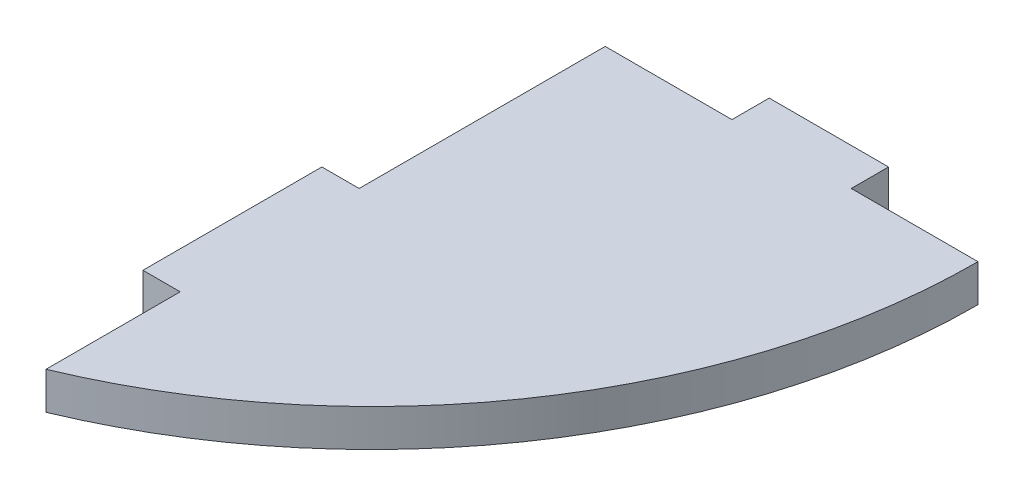
ISO-10303-21;
HEADER;
FILE_DESCRIPTION(('STEP AP214'),'2;1');
FILE_NAME('part.step','',(''),(''),'','','');
FILE_SCHEMA(('AUTOMOTIVE_DESIGN { 1 0 10303 214 1 1 1 1 }'));
ENDSEC;
DATA;
#1=APPLICATION_CONTEXT('core data for automotive mechanical design processes');
#2=APPLICATION_PROTOCOL_DEFINITION('international standard','automotive_design',2000,#1);
#3=PRODUCT_CONTEXT('',#1,'mechanical');
#4=PRODUCT('Part','Part','',(#3));
#5=PRODUCT_RELATED_PRODUCT_CATEGORY('part','',(#4));
#6=PRODUCT_DEFINITION_FORMATION('','',#4);
#7=PRODUCT_DEFINITION_CONTEXT('part definition',#1,'design');
#8=PRODUCT_DEFINITION('design','',#6,#7);
#9=PRODUCT_DEFINITION_SHAPE('','',#8);
#10=(LENGTH_UNIT() NAMED_UNIT(*) SI_UNIT(.MILLI.,.METRE.));
#11=(NAMED_UNIT(*) PLANE_ANGLE_UNIT() SI_UNIT($,.RADIAN.));
#12=(NAMED_UNIT(*) SI_UNIT($,.STERADIAN.) SOLID_ANGLE_UNIT());
#13=UNCERTAINTY_MEASURE_WITH_UNIT(LENGTH_MEASURE(1.E-05),#10,'distance_accuracy_value','');
#14=(GEOMETRIC_REPRESENTATION_CONTEXT(3) GLOBAL_UNCERTAINTY_ASSIGNED_CONTEXT((#13)) GLOBAL_UNIT_ASSIGNED_CONTEXT((#10,
#11,#12)) REPRESENTATION_CONTEXT('',''));
#15=CARTESIAN_POINT('',(0.,0.,0.));
#16=DIRECTION('',(0.,0.,1.));
#17=DIRECTION('',(1.,0.,0.));
#18=AXIS2_PLACEMENT_3D('',#15,#16,#17);
#19=CARTESIAN_POINT('',(13.97,3.175,-50.8));
#20=DIRECTION('',(1.,0.,0.));
#21=DIRECTION('',(0.,0.,-1.));
#22=AXIS2_PLACEMENT_3D('',#19,#20,#21);
#23=PLANE('',#22);
#24=DIRECTION('',(0.,0.,1.));
#25=VECTOR('',#24,1.);
#26=CARTESIAN_POINT('',(13.97,0.,-50.8));
#27=LINE('',#26,#25);
#28=CARTESIAN_POINT('',(13.97,0.,-50.8));
#29=VERTEX_POINT('',#28);
#30=CARTESIAN_POINT('',(13.97,0.,-47.625));
#31=VERTEX_POINT('',#30);
#32=EDGE_CURVE('E147',#29,#31,#27,.T.);
#33=ORIENTED_EDGE('',*,*,#32,.T.);
#34=DIRECTION('',(0.,-1.,0.));
#35=VECTOR('',#34,1.);
#36=CARTESIAN_POINT('',(13.97,3.175,-47.625));
#37=LINE('',#36,#35);
#38=CARTESIAN_POINT('',(13.97,3.175,-47.625));
#39=VERTEX_POINT('',#38);
#40=EDGE_CURVE('E11',#39,#31,#37,.T.);
#41=ORIENTED_EDGE('',*,*,#40,.F.);
#42=DIRECTION('',(0.,0.,1.));
#43=VECTOR('',#42,1.);
#44=CARTESIAN_POINT('',(13.97,3.175,-50.8));
#45=LINE('',#44,#43);
#46=CARTESIAN_POINT('',(13.97,3.175,-50.8));
#47=VERTEX_POINT('',#46);
#48=EDGE_CURVE('E167',#47,#39,#45,.T.);
#49=ORIENTED_EDGE('',*,*,#48,.F.);
#50=DIRECTION('',(0.,-1.,0.));
#51=VECTOR('',#50,1.);
#52=CARTESIAN_POINT('',(13.97,3.175,-50.8));
#53=LINE('',#52,#51);
#54=EDGE_CURVE('E143',#47,#29,#53,.T.);
#55=ORIENTED_EDGE('',*,*,#54,.T.);
#56=EDGE_LOOP('',(#33,#41,#49,#55));
#57=FACE_BOUND('',#56,.T.);
#58=ADVANCED_FACE('F33',(#57),#23,.F.);
#59=CARTESIAN_POINT('',(13.97,3.175,-47.625));
#60=DIRECTION('',(0.,0.,1.));
#61=DIRECTION('',(1.,0.,0.));
#62=AXIS2_PLACEMENT_3D('',#59,#60,#61);
#63=PLANE('',#62);
#64=DIRECTION('',(-1.,0.,0.));
#65=VECTOR('',#64,1.);
#66=CARTESIAN_POINT('',(13.97,0.,-47.625));
#67=LINE('',#66,#65);
#68=CARTESIAN_POINT('',(3.175,0.,-47.625));
#69=VERTEX_POINT('',#68);
#70=EDGE_CURVE('E150',#31,#69,#67,.T.);
#71=ORIENTED_EDGE('',*,*,#70,.T.);
#72=DIRECTION('',(0.,-1.,0.));
#73=VECTOR('',#72,1.);
#74=CARTESIAN_POINT('',(3.175,3.175,-47.625));
#75=LINE('',#74,#73);
#76=CARTESIAN_POINT('',(3.175,3.175,-47.625));
#77=VERTEX_POINT('',#76);
#78=EDGE_CURVE('E41',#77,#69,#75,.T.);
#79=ORIENTED_EDGE('',*,*,#78,.F.);
#80=DIRECTION('',(-1.,0.,0.));
#81=VECTOR('',#80,1.);
#82=CARTESIAN_POINT('',(13.97,3.175,-47.625));
#83=LINE('',#82,#81);
#84=EDGE_CURVE('E101',#39,#77,#83,.T.);
#85=ORIENTED_EDGE('',*,*,#84,.F.);
#86=ORIENTED_EDGE('',*,*,#40,.T.);
#87=EDGE_LOOP('',(#71,#79,#85,#86));
#88=FACE_BOUND('',#87,.T.);
#89=ADVANCED_FACE('F239',(#88),#63,.F.);
#90=CARTESIAN_POINT('',(3.175,3.175,-26.67));
#91=DIRECTION('',(1.,0.,0.));
#92=DIRECTION('',(0.,0.,-1.));
#93=AXIS2_PLACEMENT_3D('',#90,#91,#92);
#94=PLANE('',#93);
#95=DIRECTION('',(0.,0.,1.));
#96=VECTOR('',#95,1.);
#97=CARTESIAN_POINT('',(3.175,0.,-26.67));
#98=LINE('',#97,#96);
#99=CARTESIAN_POINT('',(3.175,0.,-26.67));
#100=VERTEX_POINT('',#99);
#101=EDGE_CURVE('E152',#69,#100,#98,.T.);
#102=ORIENTED_EDGE('',*,*,#101,.T.);
#103=DIRECTION('',(0.,-1.,0.));
#104=VECTOR('',#103,1.);
#105=CARTESIAN_POINT('',(3.175,3.175,-26.67));
#106=LINE('',#105,#104);
#107=CARTESIAN_POINT('',(3.175,3.175,-26.67));
#108=VERTEX_POINT('',#107);
#109=EDGE_CURVE('E183',#108,#100,#106,.T.);
#110=ORIENTED_EDGE('',*,*,#109,.F.);
#111=DIRECTION('',(0.,0.,1.));
#112=VECTOR('',#111,1.);
#113=CARTESIAN_POINT('',(3.175,3.175,-26.67));
#114=LINE('',#113,#112);
#115=EDGE_CURVE('E191',#77,#108,#114,.T.);
#116=ORIENTED_EDGE('',*,*,#115,.F.);
#117=ORIENTED_EDGE('',*,*,#78,.T.);
#118=EDGE_LOOP('',(#102,#110,#116,#117));
#119=FACE_BOUND('',#118,.T.);
#120=ADVANCED_FACE('F189',(#119),#94,.F.);
#121=CARTESIAN_POINT('',(0.,3.175,-26.67));
#122=DIRECTION('',(0.,0.,1.));
#123=DIRECTION('',(1.,0.,0.));
#124=AXIS2_PLACEMENT_3D('',#121,#122,#123);
#125=PLANE('',#124);
#126=DIRECTION('',(-1.,0.,0.));
#127=VECTOR('',#126,1.);
#128=CARTESIAN_POINT('',(0.,0.,-26.67));
#129=LINE('',#128,#127);
#130=CARTESIAN_POINT('',(0.,0.,-26.67));
#131=VERTEX_POINT('',#130);
#132=EDGE_CURVE('E154',#100,#131,#129,.T.);
#133=ORIENTED_EDGE('',*,*,#132,.T.);
#134=DIRECTION('',(0.,-1.,0.));
#135=VECTOR('',#134,1.);
#136=CARTESIAN_POINT('',(0.,3.175,-26.67));
#137=LINE('',#136,#135);
#138=CARTESIAN_POINT('',(0.,3.175,-26.67));
#139=VERTEX_POINT('',#138);
#140=EDGE_CURVE('E180',#139,#131,#137,.T.);
#141=ORIENTED_EDGE('',*,*,#140,.F.);
#142=DIRECTION('',(-1.,0.,0.));
#143=VECTOR('',#142,1.);
#144=CARTESIAN_POINT('',(0.,3.175,-26.67));
#145=LINE('',#144,#143);
#146=EDGE_CURVE('E209',#108,#139,#145,.T.);
#147=ORIENTED_EDGE('',*,*,#146,.F.);
#148=ORIENTED_EDGE('',*,*,#109,.T.);
#149=EDGE_LOOP('',(#133,#141,#147,#148));
#150=FACE_BOUND('',#149,.T.);
#151=ADVANCED_FACE('F200',(#150),#125,.F.);
#152=CARTESIAN_POINT('',(0.,3.175,-11.43));
#153=DIRECTION('',(1.,0.,0.));
#154=DIRECTION('',(0.,0.,-1.));
#155=AXIS2_PLACEMENT_3D('',#152,#153,#154);
#156=PLANE('',#155);
#157=DIRECTION('',(0.,0.,1.));
#158=VECTOR('',#157,1.);
#159=CARTESIAN_POINT('',(0.,0.,-11.43));
#160=LINE('',#159,#158);
#161=CARTESIAN_POINT('',(0.,0.,-11.43));
#162=VERTEX_POINT('',#161);
#163=EDGE_CURVE('E156',#131,#162,#160,.T.);
#164=ORIENTED_EDGE('',*,*,#163,.T.);
#165=DIRECTION('',(0.,-1.,0.));
#166=VECTOR('',#165,1.);
#167=CARTESIAN_POINT('',(0.,3.175,-11.43));
#168=LINE('',#167,#166);
#169=CARTESIAN_POINT('',(0.,3.175,-11.43));
#170=VERTEX_POINT('',#169);
#171=EDGE_CURVE('E177',#170,#162,#168,.T.);
#172=ORIENTED_EDGE('',*,*,#171,.F.);
#173=DIRECTION('',(0.,0.,1.));
#174=VECTOR('',#173,1.);
#175=CARTESIAN_POINT('',(0.,3.175,-11.43));
#176=LINE('',#175,#174);
#177=EDGE_CURVE('E206',#139,#170,#176,.T.);
#178=ORIENTED_EDGE('',*,*,#177,.F.);
#179=ORIENTED_EDGE('',*,*,#140,.T.);
#180=EDGE_LOOP('',(#164,#172,#178,#179));
#181=FACE_BOUND('',#180,.T.);
#182=ADVANCED_FACE('F204',(#181),#156,.F.);
#183=CARTESIAN_POINT('',(0.,3.175,-11.43));
#184=DIRECTION('',(0.,0.,-1.));
#185=DIRECTION('',(-1.,0.,0.));
#186=AXIS2_PLACEMENT_3D('',#183,#184,#185);
#187=PLANE('',#186);
#188=DIRECTION('',(1.,0.,0.));
#189=VECTOR('',#188,1.);
#190=CARTESIAN_POINT('',(0.,0.,-11.43));
#191=LINE('',#190,#189);
#192=CARTESIAN_POINT('',(3.175,0.,-11.43));
#193=VERTEX_POINT('',#192);
#194=EDGE_CURVE('E158',#162,#193,#191,.T.);
#195=ORIENTED_EDGE('',*,*,#194,.T.);
#196=DIRECTION('',(0.,-1.,0.));
#197=VECTOR('',#196,1.);
#198=CARTESIAN_POINT('',(3.175,3.175,-11.43));
#199=LINE('',#198,#197);
#200=CARTESIAN_POINT('',(3.175,3.175,-11.43));
#201=VERTEX_POINT('',#200);
#202=EDGE_CURVE('E174',#201,#193,#199,.T.);
#203=ORIENTED_EDGE('',*,*,#202,.F.);
#204=DIRECTION('',(1.,0.,0.));
#205=VECTOR('',#204,1.);
#206=CARTESIAN_POINT('',(0.,3.175,-11.43));
#207=LINE('',#206,#205);
#208=EDGE_CURVE('E208',#170,#201,#207,.T.);
#209=ORIENTED_EDGE('',*,*,#208,.F.);
#210=ORIENTED_EDGE('',*,*,#171,.T.);
#211=EDGE_LOOP('',(#195,#203,#209,#210));
#212=FACE_BOUND('',#211,.T.);
#213=ADVANCED_FACE('F252',(#212),#187,.F.);
#214=CARTESIAN_POINT('',(3.175,3.175,-11.43));
#215=DIRECTION('',(1.,0.,0.));
#216=DIRECTION('',(0.,0.,-1.));
#217=AXIS2_PLACEMENT_3D('',#214,#215,#216);
#218=PLANE('',#217);
#219=DIRECTION('',(0.,0.,1.));
#220=VECTOR('',#219,1.);
#221=CARTESIAN_POINT('',(3.175,0.,-11.43));
#222=LINE('',#221,#220);
#223=CARTESIAN_POINT('',(3.175,0.,0.));
#224=VERTEX_POINT('',#223);
#225=EDGE_CURVE('E160',#193,#224,#222,.T.);
#226=ORIENTED_EDGE('',*,*,#225,.T.);
#227=DIRECTION('',(0.,-1.,0.));
#228=VECTOR('',#227,1.);
#229=CARTESIAN_POINT('',(3.175,3.175,0.));
#230=LINE('',#229,#228);
#231=CARTESIAN_POINT('',(3.175,3.175,0.));
#232=VERTEX_POINT('',#231);
#233=EDGE_CURVE('E171',#232,#224,#230,.T.);
#234=ORIENTED_EDGE('',*,*,#233,.F.);
#235=DIRECTION('',(0.,0.,1.));
#236=VECTOR('',#235,1.);
#237=CARTESIAN_POINT('',(3.175,3.175,-11.43));
#238=LINE('',#237,#236);
#239=EDGE_CURVE('E211',#201,#232,#238,.T.);
#240=ORIENTED_EDGE('',*,*,#239,.F.);
#241=ORIENTED_EDGE('',*,*,#202,.T.);
#242=EDGE_LOOP('',(#226,#234,#240,#241));
#243=FACE_BOUND('',#242,.T.);
#244=ADVANCED_FACE('F220',(#243),#218,.F.);
#245=CARTESIAN_POINT('',(-16.66875,3.175,-47.625));
#246=DIRECTION('',(0.,-1.,0.));
#247=DIRECTION('',(0.,0.,-1.));
#248=AXIS2_PLACEMENT_3D('',#245,#246,#247);
#249=CYLINDRICAL_SURFACE('',#248,51.59375);
#250=CARTESIAN_POINT('',(-16.66875,0.,-47.625));
#251=DIRECTION('',(0.,1.,0.));
#252=DIRECTION('',(0.,0.,-1.));
#253=AXIS2_PLACEMENT_3D('',#250,#251,#252);
#254=CIRCLE('',#253,51.59375);
#255=CARTESIAN_POINT('',(34.925,0.,-47.625));
#256=VERTEX_POINT('',#255);
#257=EDGE_CURVE('E162',#224,#256,#254,.T.);
#258=ORIENTED_EDGE('',*,*,#257,.T.);
#259=DIRECTION('',(0.,-1.,0.));
#260=VECTOR('',#259,1.);
#261=CARTESIAN_POINT('',(34.925,3.175,-47.625));
#262=LINE('',#261,#260);
#263=CARTESIAN_POINT('',(34.925,3.175,-47.625));
#264=VERTEX_POINT('',#263);
#265=EDGE_CURVE('E138',#264,#256,#262,.T.);
#266=ORIENTED_EDGE('',*,*,#265,.F.);
#267=CARTESIAN_POINT('',(-16.66875,3.175,-47.625));
#268=DIRECTION('',(0.,1.,0.));
#269=DIRECTION('',(0.,0.,-1.));
#270=AXIS2_PLACEMENT_3D('',#267,#268,#269);
#271=CIRCLE('',#270,51.59375);
#272=EDGE_CURVE('E129',#232,#264,#271,.T.);
#273=ORIENTED_EDGE('',*,*,#272,.F.);
#274=ORIENTED_EDGE('',*,*,#233,.T.);
#275=EDGE_LOOP('',(#258,#266,#273,#274));
#276=FACE_BOUND('',#275,.T.);
#277=ADVANCED_FACE('F224',(#276),#249,.T.);
#278=CARTESIAN_POINT('',(24.13,3.175,-47.625));
#279=DIRECTION('',(0.,0.,1.));
#280=DIRECTION('',(1.,0.,0.));
#281=AXIS2_PLACEMENT_3D('',#278,#279,#280);
#282=PLANE('',#281);
#283=DIRECTION('',(-1.,0.,0.));
#284=VECTOR('',#283,1.);
#285=CARTESIAN_POINT('',(24.13,0.,-47.625));
#286=LINE('',#285,#284);
#287=CARTESIAN_POINT('',(24.13,0.,-47.625));
#288=VERTEX_POINT('',#287);
#289=EDGE_CURVE('E137',#256,#288,#286,.T.);
#290=ORIENTED_EDGE('',*,*,#289,.T.);
#291=DIRECTION('',(0.,-1.,0.));
#292=VECTOR('',#291,1.);
#293=CARTESIAN_POINT('',(24.13,3.175,-47.625));
#294=LINE('',#293,#292);
#295=CARTESIAN_POINT('',(24.13,3.175,-47.625));
#296=VERTEX_POINT('',#295);
#297=EDGE_CURVE('E134',#296,#288,#294,.T.);
#298=ORIENTED_EDGE('',*,*,#297,.F.);
#299=DIRECTION('',(-1.,0.,0.));
#300=VECTOR('',#299,1.);
#301=CARTESIAN_POINT('',(24.13,3.175,-47.625));
#302=LINE('',#301,#300);
#303=EDGE_CURVE('E123',#264,#296,#302,.T.);
#304=ORIENTED_EDGE('',*,*,#303,.F.);
#305=ORIENTED_EDGE('',*,*,#265,.T.);
#306=EDGE_LOOP('',(#290,#298,#304,#305));
#307=FACE_BOUND('',#306,.T.);
#308=ADVANCED_FACE('F135',(#307),#282,.F.);
#309=CARTESIAN_POINT('',(24.13,3.175,-50.8));
#310=DIRECTION('',(-1.,0.,0.));
#311=DIRECTION('',(0.,0.,1.));
#312=AXIS2_PLACEMENT_3D('',#309,#310,#311);
#313=PLANE('',#312);
#314=DIRECTION('',(0.,0.,-1.));
#315=VECTOR('',#314,1.);
#316=CARTESIAN_POINT('',(24.13,0.,-50.8));
#317=LINE('',#316,#315);
#318=CARTESIAN_POINT('',(24.13,0.,-50.8));
#319=VERTEX_POINT('',#318);
#320=EDGE_CURVE('E87',#288,#319,#317,.T.);
#321=ORIENTED_EDGE('',*,*,#320,.T.);
#322=DIRECTION('',(0.,-1.,0.));
#323=VECTOR('',#322,1.);
#324=CARTESIAN_POINT('',(24.13,3.175,-50.8));
#325=LINE('',#324,#323);
#326=CARTESIAN_POINT('',(24.13,3.175,-50.8));
#327=VERTEX_POINT('',#326);
#328=EDGE_CURVE('E139',#327,#319,#325,.T.);
#329=ORIENTED_EDGE('',*,*,#328,.F.);
#330=DIRECTION('',(0.,0.,-1.));
#331=VECTOR('',#330,1.);
#332=CARTESIAN_POINT('',(24.13,3.175,-50.8));
#333=LINE('',#332,#331);
#334=EDGE_CURVE('E127',#296,#327,#333,.T.);
#335=ORIENTED_EDGE('',*,*,#334,.F.);
#336=ORIENTED_EDGE('',*,*,#297,.T.);
#337=EDGE_LOOP('',(#321,#329,#335,#336));
#338=FACE_BOUND('',#337,.T.);
#339=ADVANCED_FACE('F141',(#338),#313,.F.);
#340=CARTESIAN_POINT('',(13.97,3.175,-50.8));
#341=DIRECTION('',(0.,0.,1.));
#342=DIRECTION('',(1.,0.,0.));
#343=AXIS2_PLACEMENT_3D('',#340,#341,#342);
#344=PLANE('',#343);
#345=DIRECTION('',(-1.,0.,0.));
#346=VECTOR('',#345,1.);
#347=CARTESIAN_POINT('',(13.97,0.,-50.8));
#348=LINE('',#347,#346);
#349=EDGE_CURVE('E93',#319,#29,#348,.T.);
#350=ORIENTED_EDGE('',*,*,#349,.T.);
#351=ORIENTED_EDGE('',*,*,#54,.F.);
#352=DIRECTION('',(-1.,0.,0.));
#353=VECTOR('',#352,1.);
#354=CARTESIAN_POINT('',(13.97,3.175,-50.8));
#355=LINE('',#354,#353);
#356=EDGE_CURVE('E49',#327,#47,#355,.T.);
#357=ORIENTED_EDGE('',*,*,#356,.F.);
#358=ORIENTED_EDGE('',*,*,#328,.T.);
#359=EDGE_LOOP('',(#350,#351,#357,#358));
#360=FACE_BOUND('',#359,.T.);
#361=ADVANCED_FACE('F228',(#360),#344,.F.);
#362=CARTESIAN_POINT('',(-16.66875,3.175,-47.625));
#363=DIRECTION('',(0.,-1.,0.));
#364=DIRECTION('',(0.,0.,-1.));
#365=AXIS2_PLACEMENT_3D('',#362,#363,#364);
#366=PLANE('',#365);
#367=ORIENTED_EDGE('',*,*,#48,.T.);
#368=ORIENTED_EDGE('',*,*,#84,.T.);
#369=ORIENTED_EDGE('',*,*,#115,.T.);
#370=ORIENTED_EDGE('',*,*,#146,.T.);
#371=ORIENTED_EDGE('',*,*,#177,.T.);
#372=ORIENTED_EDGE('',*,*,#208,.T.);
#373=ORIENTED_EDGE('',*,*,#239,.T.);
#374=ORIENTED_EDGE('',*,*,#272,.T.);
#375=ORIENTED_EDGE('',*,*,#303,.T.);
#376=ORIENTED_EDGE('',*,*,#334,.T.);
#377=ORIENTED_EDGE('',*,*,#356,.T.);
#378=EDGE_LOOP('',(#367,#368,#369,#370,#371,#372,#373,#374,#375,#376,#377));
#379=FACE_BOUND('',#378,.T.);
#380=ADVANCED_FACE('F125',(#379),#366,.F.);
#381=CARTESIAN_POINT('',(-16.66875,0.,-47.625));
#382=DIRECTION('',(0.,-1.,0.));
#383=DIRECTION('',(0.,0.,-1.));
#384=AXIS2_PLACEMENT_3D('',#381,#382,#383);
#385=PLANE('',#384);
#386=ORIENTED_EDGE('',*,*,#32,.F.);
#387=ORIENTED_EDGE('',*,*,#349,.F.);
#388=ORIENTED_EDGE('',*,*,#320,.F.);
#389=ORIENTED_EDGE('',*,*,#289,.F.);
#390=ORIENTED_EDGE('',*,*,#257,.F.);
#391=ORIENTED_EDGE('',*,*,#225,.F.);
#392=ORIENTED_EDGE('',*,*,#194,.F.);
#393=ORIENTED_EDGE('',*,*,#163,.F.);
#394=ORIENTED_EDGE('',*,*,#132,.F.);
#395=ORIENTED_EDGE('',*,*,#101,.F.);
#396=ORIENTED_EDGE('',*,*,#70,.F.);
#397=EDGE_LOOP('',(#386,#387,#388,#389,#390,#391,#392,#393,#394,#395,#396));
#398=FACE_BOUND('',#397,.T.);
#399=ADVANCED_FACE('F195',(#398),#385,.T.);
#400=CLOSED_SHELL('',(#58,#89,#120,#151,#182,#213,#244,#277,#308,#339,#361,#380,#399));
#401=MANIFOLD_SOLID_BREP('B2',#400);
#402=ADVANCED_BREP_SHAPE_REPRESENTATION('',(#18,#401),#14);
#403=SHAPE_DEFINITION_REPRESENTATION(#9,#402);
ENDSEC;
END-ISO-10303-21;
